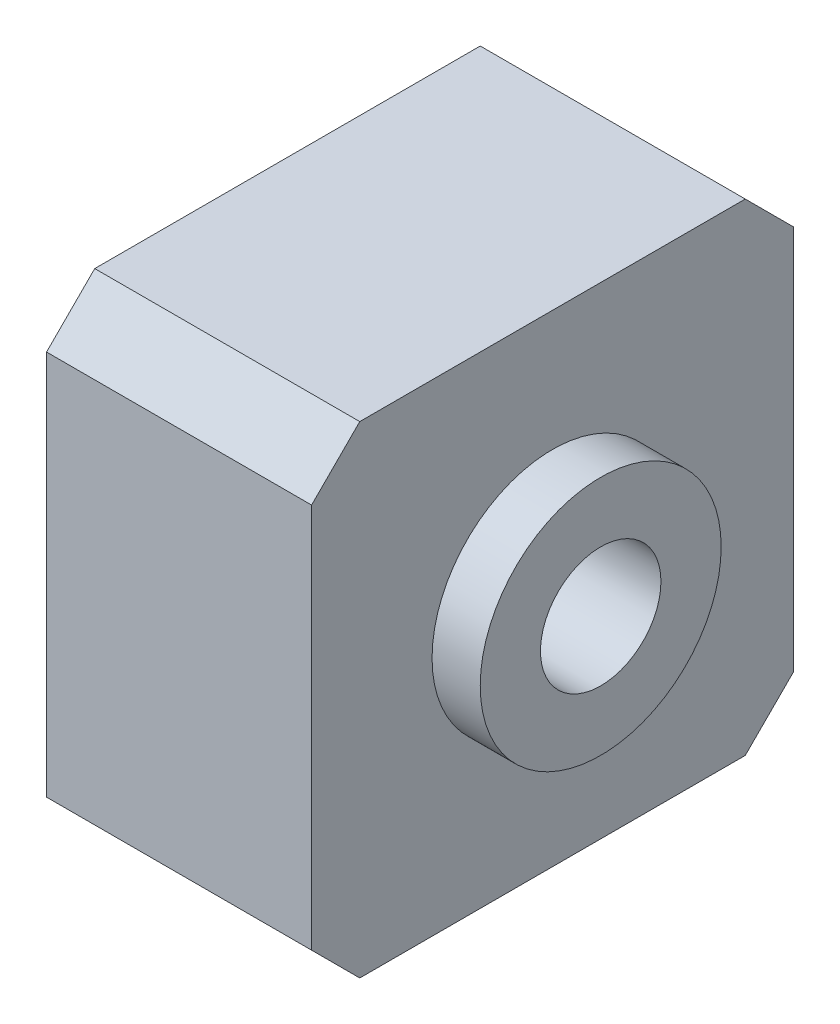
ISO-10303-21;
HEADER;
FILE_DESCRIPTION(('STEP AP214'),'2;1');
FILE_NAME('part.step','',(''),(''),'','','');
FILE_SCHEMA(('AUTOMOTIVE_DESIGN { 1 0 10303 214 1 1 1 1 }'));
ENDSEC;
DATA;
#1=APPLICATION_CONTEXT('core data for automotive mechanical design processes');
#2=APPLICATION_PROTOCOL_DEFINITION('international standard','automotive_design',2000,#1);
#3=PRODUCT_CONTEXT('',#1,'mechanical');
#4=PRODUCT('Part','Part','',(#3));
#5=PRODUCT_RELATED_PRODUCT_CATEGORY('part','',(#4));
#6=PRODUCT_DEFINITION_FORMATION('','',#4);
#7=PRODUCT_DEFINITION_CONTEXT('part definition',#1,'design');
#8=PRODUCT_DEFINITION('design','',#6,#7);
#9=PRODUCT_DEFINITION_SHAPE('','',#8);
#10=(LENGTH_UNIT() NAMED_UNIT(*) SI_UNIT(.MILLI.,.METRE.));
#11=(NAMED_UNIT(*) PLANE_ANGLE_UNIT() SI_UNIT($,.RADIAN.));
#12=(NAMED_UNIT(*) SI_UNIT($,.STERADIAN.) SOLID_ANGLE_UNIT());
#13=UNCERTAINTY_MEASURE_WITH_UNIT(LENGTH_MEASURE(1.E-05),#10,'distance_accuracy_value','');
#14=(GEOMETRIC_REPRESENTATION_CONTEXT(3) GLOBAL_UNCERTAINTY_ASSIGNED_CONTEXT((#13)) GLOBAL_UNIT_ASSIGNED_CONTEXT((#10,
#11,#12)) REPRESENTATION_CONTEXT('',''));
#15=CARTESIAN_POINT('',(0.,0.,0.));
#16=DIRECTION('',(0.,0.,1.));
#17=DIRECTION('',(1.,0.,0.));
#18=AXIS2_PLACEMENT_3D('',#15,#16,#17);
#19=CARTESIAN_POINT('',(-17.,10.,9.99999999999999));
#20=DIRECTION('',(0.,0.,1.));
#21=DIRECTION('',(0.,-1.,0.));
#22=AXIS2_PLACEMENT_3D('',#19,#20,#21);
#23=PLANE('',#22);
#24=DIRECTION('',(0.,-1.,0.));
#25=VECTOR('',#24,1.);
#26=CARTESIAN_POINT('',(-13.,10.,9.99999999999999));
#27=LINE('',#26,#25);
#28=CARTESIAN_POINT('',(-13.,8.,9.99999999999999));
#29=VERTEX_POINT('',#28);
#30=CARTESIAN_POINT('',(-13.,-8.,10.));
#31=VERTEX_POINT('',#30);
#32=EDGE_CURVE('E144',#29,#31,#27,.T.);
#33=ORIENTED_EDGE('',*,*,#32,.T.);
#34=DIRECTION('',(1.,0.,0.));
#35=VECTOR('',#34,1.);
#36=CARTESIAN_POINT('',(-17.,-8.,10.));
#37=LINE('',#36,#35);
#38=CARTESIAN_POINT('',(-2.,-8.,10.));
#39=VERTEX_POINT('',#38);
#40=EDGE_CURVE('E121',#31,#39,#37,.T.);
#41=ORIENTED_EDGE('',*,*,#40,.T.);
#42=DIRECTION('',(0.,1.,0.));
#43=VECTOR('',#42,1.);
#44=CARTESIAN_POINT('',(-2.,10.,9.99999999999999));
#45=LINE('',#44,#43);
#46=CARTESIAN_POINT('',(-2.,8.,9.99999999999999));
#47=VERTEX_POINT('',#46);
#48=EDGE_CURVE('E164',#39,#47,#45,.T.);
#49=ORIENTED_EDGE('',*,*,#48,.T.);
#50=DIRECTION('',(-1.,0.,0.));
#51=VECTOR('',#50,1.);
#52=CARTESIAN_POINT('',(-17.,8.,9.99999999999999));
#53=LINE('',#52,#51);
#54=EDGE_CURVE('E56',#47,#29,#53,.T.);
#55=ORIENTED_EDGE('',*,*,#54,.T.);
#56=EDGE_LOOP('',(#33,#41,#49,#55));
#57=FACE_BOUND('',#56,.T.);
#58=ADVANCED_FACE('F34',(#57),#23,.T.);
#59=CARTESIAN_POINT('',(-17.,10.,-9.99999999999999));
#60=DIRECTION('',(0.,1.,0.));
#61=DIRECTION('',(0.,0.,1.));
#62=AXIS2_PLACEMENT_3D('',#59,#60,#61);
#63=PLANE('',#62);
#64=DIRECTION('',(0.,0.,1.));
#65=VECTOR('',#64,1.);
#66=CARTESIAN_POINT('',(-13.,10.,-9.99999999999999));
#67=LINE('',#66,#65);
#68=CARTESIAN_POINT('',(-13.,10.,-7.99999999999999));
#69=VERTEX_POINT('',#68);
#70=CARTESIAN_POINT('',(-13.,10.,8.));
#71=VERTEX_POINT('',#70);
#72=EDGE_CURVE('E136',#69,#71,#67,.T.);
#73=ORIENTED_EDGE('',*,*,#72,.T.);
#74=DIRECTION('',(1.,0.,0.));
#75=VECTOR('',#74,1.);
#76=CARTESIAN_POINT('',(-17.,10.,8.));
#77=LINE('',#76,#75);
#78=CARTESIAN_POINT('',(-2.,10.,8.));
#79=VERTEX_POINT('',#78);
#80=EDGE_CURVE('E11',#71,#79,#77,.T.);
#81=ORIENTED_EDGE('',*,*,#80,.T.);
#82=DIRECTION('',(0.,0.,-1.));
#83=VECTOR('',#82,1.);
#84=CARTESIAN_POINT('',(-2.,10.,-9.99999999999999));
#85=LINE('',#84,#83);
#86=CARTESIAN_POINT('',(-2.,10.,-7.99999999999999));
#87=VERTEX_POINT('',#86);
#88=EDGE_CURVE('E139',#79,#87,#85,.T.);
#89=ORIENTED_EDGE('',*,*,#88,.T.);
#90=DIRECTION('',(-1.,0.,0.));
#91=VECTOR('',#90,1.);
#92=CARTESIAN_POINT('',(-17.,10.,-7.99999999999999));
#93=LINE('',#92,#91);
#94=EDGE_CURVE('E42',#87,#69,#93,.T.);
#95=ORIENTED_EDGE('',*,*,#94,.T.);
#96=EDGE_LOOP('',(#73,#81,#89,#95));
#97=FACE_BOUND('',#96,.T.);
#98=ADVANCED_FACE('F135',(#97),#63,.T.);
#99=CARTESIAN_POINT('',(-17.,-10.,-10.));
#100=DIRECTION('',(0.,0.,-1.));
#101=DIRECTION('',(0.,1.,0.));
#102=AXIS2_PLACEMENT_3D('',#99,#100,#101);
#103=PLANE('',#102);
#104=CARTESIAN_POINT('',(-7.,0.,-10.));
#105=DIRECTION('',(0.,0.,-1.));
#106=DIRECTION('',(0.,1.,0.));
#107=AXIS2_PLACEMENT_3D('',#104,#105,#106);
#108=CIRCLE('',#107,2.75);
#109=CARTESIAN_POINT('',(-7.,2.75,-10.));
#110=VERTEX_POINT('',#109);
#111=EDGE_CURVE('E191',#110,#110,#108,.T.);
#112=ORIENTED_EDGE('',*,*,#111,.F.);
#113=EDGE_LOOP('',(#112));
#114=FACE_BOUND('',#113,.T.);
#115=DIRECTION('',(0.,-1.,0.));
#116=VECTOR('',#115,1.);
#117=CARTESIAN_POINT('',(-2.,-10.,-10.));
#118=LINE('',#117,#116);
#119=CARTESIAN_POINT('',(-2.,8.,-9.99999999999999));
#120=VERTEX_POINT('',#119);
#121=CARTESIAN_POINT('',(-2.,-8.,-10.));
#122=VERTEX_POINT('',#121);
#123=EDGE_CURVE('E167',#120,#122,#118,.T.);
#124=ORIENTED_EDGE('',*,*,#123,.T.);
#125=DIRECTION('',(-1.,0.,0.));
#126=VECTOR('',#125,1.);
#127=CARTESIAN_POINT('',(-17.,-8.,-10.));
#128=LINE('',#127,#126);
#129=CARTESIAN_POINT('',(-13.,-8.,-10.));
#130=VERTEX_POINT('',#129);
#131=EDGE_CURVE('E150',#122,#130,#128,.T.);
#132=ORIENTED_EDGE('',*,*,#131,.T.);
#133=DIRECTION('',(0.,1.,0.));
#134=VECTOR('',#133,1.);
#135=CARTESIAN_POINT('',(-13.,-10.,-10.));
#136=LINE('',#135,#134);
#137=CARTESIAN_POINT('',(-13.,8.,-9.99999999999999));
#138=VERTEX_POINT('',#137);
#139=EDGE_CURVE('E145',#130,#138,#136,.T.);
#140=ORIENTED_EDGE('',*,*,#139,.T.);
#141=DIRECTION('',(1.,0.,0.));
#142=VECTOR('',#141,1.);
#143=CARTESIAN_POINT('',(-17.,8.,-9.99999999999999));
#144=LINE('',#143,#142);
#145=EDGE_CURVE('E149',#138,#120,#144,.T.);
#146=ORIENTED_EDGE('',*,*,#145,.T.);
#147=EDGE_LOOP('',(#124,#132,#140,#146));
#148=FACE_BOUND('',#147,.T.);
#149=ADVANCED_FACE('F205',(#114,#148),#103,.T.);
#150=CARTESIAN_POINT('',(-17.,-10.,10.));
#151=DIRECTION('',(0.,-1.,0.));
#152=DIRECTION('',(0.,0.,-1.));
#153=AXIS2_PLACEMENT_3D('',#150,#151,#152);
#154=PLANE('',#153);
#155=DIRECTION('',(0.,0.,-1.));
#156=VECTOR('',#155,1.);
#157=CARTESIAN_POINT('',(-13.,-10.,10.));
#158=LINE('',#157,#156);
#159=CARTESIAN_POINT('',(-13.,-10.,7.99999999999999));
#160=VERTEX_POINT('',#159);
#161=CARTESIAN_POINT('',(-13.,-10.,-8.00000000000001));
#162=VERTEX_POINT('',#161);
#163=EDGE_CURVE('E105',#160,#162,#158,.T.);
#164=ORIENTED_EDGE('',*,*,#163,.T.);
#165=DIRECTION('',(1.,0.,0.));
#166=VECTOR('',#165,1.);
#167=CARTESIAN_POINT('',(-17.,-10.,-8.00000000000001));
#168=LINE('',#167,#166);
#169=CARTESIAN_POINT('',(-2.,-10.,-8.00000000000001));
#170=VERTEX_POINT('',#169);
#171=EDGE_CURVE('E110',#162,#170,#168,.T.);
#172=ORIENTED_EDGE('',*,*,#171,.T.);
#173=DIRECTION('',(0.,0.,1.));
#174=VECTOR('',#173,1.);
#175=CARTESIAN_POINT('',(-2.,-10.,10.));
#176=LINE('',#175,#174);
#177=CARTESIAN_POINT('',(-2.,-10.,7.99999999999999));
#178=VERTEX_POINT('',#177);
#179=EDGE_CURVE('E108',#170,#178,#176,.T.);
#180=ORIENTED_EDGE('',*,*,#179,.T.);
#181=DIRECTION('',(-1.,0.,0.));
#182=VECTOR('',#181,1.);
#183=CARTESIAN_POINT('',(-17.,-10.,7.99999999999999));
#184=LINE('',#183,#182);
#185=EDGE_CURVE('E102',#178,#160,#184,.T.);
#186=ORIENTED_EDGE('',*,*,#185,.T.);
#187=EDGE_LOOP('',(#164,#172,#180,#186));
#188=FACE_BOUND('',#187,.T.);
#189=ADVANCED_FACE('F103',(#188),#154,.T.);
#190=CARTESIAN_POINT('',(-2.,0.,0.));
#191=DIRECTION('',(1.,0.,0.));
#192=DIRECTION('',(0.,0.,-1.));
#193=AXIS2_PLACEMENT_3D('',#190,#191,#192);
#194=PLANE('',#193);
#195=ORIENTED_EDGE('',*,*,#179,.F.);
#196=DIRECTION('',(0.,-0.707106781186549,0.707106781186546));
#197=VECTOR('',#196,1.);
#198=CARTESIAN_POINT('',(-2.,-8.99999999999998,-9.00000000000002));
#199=LINE('',#198,#197);
#200=EDGE_CURVE('E154',#170,#122,#199,.F.);
#201=ORIENTED_EDGE('',*,*,#200,.T.);
#202=ORIENTED_EDGE('',*,*,#123,.F.);
#203=DIRECTION('',(0.,-0.707106781186546,-0.707106781186549));
#204=VECTOR('',#203,1.);
#205=CARTESIAN_POINT('',(-2.,9.00000000000002,-8.99999999999997));
#206=LINE('',#205,#204);
#207=EDGE_CURVE('E160',#120,#87,#206,.F.);
#208=ORIENTED_EDGE('',*,*,#207,.T.);
#209=ORIENTED_EDGE('',*,*,#88,.F.);
#210=DIRECTION('',(0.,0.707106781186549,-0.707106781186546));
#211=VECTOR('',#210,1.);
#212=CARTESIAN_POINT('',(-2.,8.99999999999997,9.00000000000002));
#213=LINE('',#212,#211);
#214=EDGE_CURVE('E158',#79,#47,#213,.F.);
#215=ORIENTED_EDGE('',*,*,#214,.T.);
#216=ORIENTED_EDGE('',*,*,#48,.F.);
#217=DIRECTION('',(0.,0.707106781186546,0.707106781186549));
#218=VECTOR('',#217,1.);
#219=CARTESIAN_POINT('',(-2.,-9.00000000000002,8.99999999999997));
#220=LINE('',#219,#218);
#221=EDGE_CURVE('E156',#39,#178,#220,.F.);
#222=ORIENTED_EDGE('',*,*,#221,.T.);
#223=EDGE_LOOP('',(#195,#201,#202,#208,#209,#215,#216,#222));
#224=FACE_BOUND('',#223,.T.);
#225=CARTESIAN_POINT('',(-2.,0.,0.));
#226=DIRECTION('',(1.,0.,0.));
#227=DIRECTION('',(0.,0.,-1.));
#228=AXIS2_PLACEMENT_3D('',#225,#226,#227);
#229=CIRCLE('',#228,5.);
#230=CARTESIAN_POINT('',(-2.,0.,-5.));
#231=VERTEX_POINT('',#230);
#232=EDGE_CURVE('E170',#231,#231,#229,.T.);
#233=ORIENTED_EDGE('',*,*,#232,.F.);
#234=EDGE_LOOP('',(#233));
#235=FACE_BOUND('',#234,.T.);
#236=ADVANCED_FACE('F214',(#224,#235),#194,.T.);
#237=CARTESIAN_POINT('',(-2.,0.,0.));
#238=DIRECTION('',(1.,0.,0.));
#239=DIRECTION('',(0.,0.,-1.));
#240=AXIS2_PLACEMENT_3D('',#237,#238,#239);
#241=CYLINDRICAL_SURFACE('',#240,5.);
#242=ORIENTED_EDGE('',*,*,#232,.T.);
#243=EDGE_LOOP('',(#242));
#244=FACE_BOUND('',#243,.T.);
#245=CARTESIAN_POINT('',(0.,0.,0.));
#246=DIRECTION('',(1.,0.,0.));
#247=DIRECTION('',(0.,0.,-1.));
#248=AXIS2_PLACEMENT_3D('',#245,#246,#247);
#249=CIRCLE('',#248,5.);
#250=CARTESIAN_POINT('',(0.,0.,-5.));
#251=VERTEX_POINT('',#250);
#252=EDGE_CURVE('E171',#251,#251,#249,.T.);
#253=ORIENTED_EDGE('',*,*,#252,.F.);
#254=EDGE_LOOP('',(#253));
#255=FACE_BOUND('',#254,.T.);
#256=ADVANCED_FACE('F257',(#244,#255),#241,.T.);
#257=CARTESIAN_POINT('',(0.,0.,0.));
#258=DIRECTION('',(1.,0.,0.));
#259=DIRECTION('',(0.,0.,-1.));
#260=AXIS2_PLACEMENT_3D('',#257,#258,#259);
#261=PLANE('',#260);
#262=CARTESIAN_POINT('',(0.,0.,0.));
#263=DIRECTION('',(1.,0.,0.));
#264=DIRECTION('',(0.,0.,-1.));
#265=AXIS2_PLACEMENT_3D('',#262,#263,#264);
#266=CIRCLE('',#265,2.5);
#267=CARTESIAN_POINT('',(0.,0.,-2.5));
#268=VERTEX_POINT('',#267);
#269=EDGE_CURVE('E185',#268,#268,#266,.T.);
#270=ORIENTED_EDGE('',*,*,#269,.F.);
#271=EDGE_LOOP('',(#270));
#272=FACE_BOUND('',#271,.T.);
#273=ORIENTED_EDGE('',*,*,#252,.T.);
#274=EDGE_LOOP('',(#273));
#275=FACE_BOUND('',#274,.T.);
#276=ADVANCED_FACE('F256',(#272,#275),#261,.T.);
#277=CARTESIAN_POINT('',(-13.,0.,0.));
#278=DIRECTION('',(-1.,0.,0.));
#279=DIRECTION('',(0.,0.,1.));
#280=AXIS2_PLACEMENT_3D('',#277,#278,#279);
#281=PLANE('',#280);
#282=ORIENTED_EDGE('',*,*,#139,.F.);
#283=DIRECTION('',(0.,0.707106781186549,-0.707106781186546));
#284=VECTOR('',#283,1.);
#285=CARTESIAN_POINT('',(-13.,-8.99999999999998,-9.00000000000002));
#286=LINE('',#285,#284);
#287=EDGE_CURVE('E116',#130,#162,#286,.F.);
#288=ORIENTED_EDGE('',*,*,#287,.T.);
#289=ORIENTED_EDGE('',*,*,#163,.F.);
#290=DIRECTION('',(0.,-0.707106781186546,-0.707106781186549));
#291=VECTOR('',#290,1.);
#292=CARTESIAN_POINT('',(-13.,-9.00000000000002,8.99999999999997));
#293=LINE('',#292,#291);
#294=EDGE_CURVE('E49',#160,#31,#293,.F.);
#295=ORIENTED_EDGE('',*,*,#294,.T.);
#296=ORIENTED_EDGE('',*,*,#32,.F.);
#297=DIRECTION('',(0.,-0.707106781186549,0.707106781186546));
#298=VECTOR('',#297,1.);
#299=CARTESIAN_POINT('',(-13.,8.99999999999997,9.00000000000002));
#300=LINE('',#299,#298);
#301=EDGE_CURVE('E122',#29,#71,#300,.F.);
#302=ORIENTED_EDGE('',*,*,#301,.T.);
#303=ORIENTED_EDGE('',*,*,#72,.F.);
#304=DIRECTION('',(0.,0.707106781186546,0.707106781186549));
#305=VECTOR('',#304,1.);
#306=CARTESIAN_POINT('',(-13.,9.00000000000002,-8.99999999999997));
#307=LINE('',#306,#305);
#308=EDGE_CURVE('E125',#69,#138,#307,.F.);
#309=ORIENTED_EDGE('',*,*,#308,.T.);
#310=EDGE_LOOP('',(#282,#288,#289,#295,#296,#302,#303,#309));
#311=FACE_BOUND('',#310,.T.);
#312=CARTESIAN_POINT('',(-13.,0.,0.));
#313=DIRECTION('',(-1.,0.,0.));
#314=DIRECTION('',(0.,0.,1.));
#315=AXIS2_PLACEMENT_3D('',#312,#313,#314);
#316=CIRCLE('',#315,5.);
#317=CARTESIAN_POINT('',(-13.,0.,5.));
#318=VERTEX_POINT('',#317);
#319=EDGE_CURVE('E178',#318,#318,#316,.T.);
#320=ORIENTED_EDGE('',*,*,#319,.F.);
#321=EDGE_LOOP('',(#320));
#322=FACE_BOUND('',#321,.T.);
#323=ADVANCED_FACE('F113',(#311,#322),#281,.T.);
#324=CARTESIAN_POINT('',(-13.,0.,0.));
#325=DIRECTION('',(-1.,0.,0.));
#326=DIRECTION('',(0.,0.,1.));
#327=AXIS2_PLACEMENT_3D('',#324,#325,#326);
#328=CYLINDRICAL_SURFACE('',#327,5.);
#329=ORIENTED_EDGE('',*,*,#319,.T.);
#330=EDGE_LOOP('',(#329));
#331=FACE_BOUND('',#330,.T.);
#332=CARTESIAN_POINT('',(-17.,0.,0.));
#333=DIRECTION('',(-1.,0.,0.));
#334=DIRECTION('',(0.,0.,1.));
#335=AXIS2_PLACEMENT_3D('',#332,#333,#334);
#336=CIRCLE('',#335,5.);
#337=CARTESIAN_POINT('',(-17.,0.,5.));
#338=VERTEX_POINT('',#337);
#339=EDGE_CURVE('E179',#338,#338,#336,.T.);
#340=ORIENTED_EDGE('',*,*,#339,.F.);
#341=EDGE_LOOP('',(#340));
#342=FACE_BOUND('',#341,.T.);
#343=ADVANCED_FACE('F244',(#331,#342),#328,.T.);
#344=CARTESIAN_POINT('',(-17.,0.,0.));
#345=DIRECTION('',(1.,0.,0.));
#346=DIRECTION('',(0.,0.,-1.));
#347=AXIS2_PLACEMENT_3D('',#344,#345,#346);
#348=PLANE('',#347);
#349=CARTESIAN_POINT('',(-17.,0.,0.));
#350=DIRECTION('',(1.,0.,0.));
#351=DIRECTION('',(0.,0.,-1.));
#352=AXIS2_PLACEMENT_3D('',#349,#350,#351);
#353=CIRCLE('',#352,2.5);
#354=CARTESIAN_POINT('',(-17.,0.,-2.5));
#355=VERTEX_POINT('',#354);
#356=EDGE_CURVE('E182',#355,#355,#353,.T.);
#357=ORIENTED_EDGE('',*,*,#356,.T.);
#358=EDGE_LOOP('',(#357));
#359=FACE_BOUND('',#358,.T.);
#360=ORIENTED_EDGE('',*,*,#339,.T.);
#361=EDGE_LOOP('',(#360));
#362=FACE_BOUND('',#361,.T.);
#363=ADVANCED_FACE('F238',(#359,#362),#348,.F.);
#364=CARTESIAN_POINT('',(-17.,0.,0.));
#365=DIRECTION('',(1.,0.,0.));
#366=DIRECTION('',(0.,0.,-1.));
#367=AXIS2_PLACEMENT_3D('',#364,#365,#366);
#368=CYLINDRICAL_SURFACE('',#367,2.5);
#369=ORIENTED_EDGE('',*,*,#356,.F.);
#370=EDGE_LOOP('',(#369));
#371=FACE_BOUND('',#370,.T.);
#372=ORIENTED_EDGE('',*,*,#269,.T.);
#373=EDGE_LOOP('',(#372));
#374=FACE_BOUND('',#373,.T.);
#375=ADVANCED_FACE('F234',(#371,#374),#368,.F.);
#376=CARTESIAN_POINT('',(-17.,-10.,-8.00000000000001));
#377=DIRECTION('',(0.,0.707106781186546,0.707106781186549));
#378=DIRECTION('',(1.,0.,0.));
#379=AXIS2_PLACEMENT_3D('',#376,#377,#378);
#380=PLANE('',#379);
#381=ORIENTED_EDGE('',*,*,#287,.F.);
#382=ORIENTED_EDGE('',*,*,#131,.F.);
#383=ORIENTED_EDGE('',*,*,#200,.F.);
#384=ORIENTED_EDGE('',*,*,#171,.F.);
#385=EDGE_LOOP('',(#381,#382,#383,#384));
#386=FACE_BOUND('',#385,.T.);
#387=ADVANCED_FACE('F213',(#386),#380,.F.);
#388=CARTESIAN_POINT('',(-17.,-8.,10.));
#389=DIRECTION('',(0.,0.707106781186549,-0.707106781186546));
#390=DIRECTION('',(1.,0.,0.));
#391=AXIS2_PLACEMENT_3D('',#388,#389,#390);
#392=PLANE('',#391);
#393=ORIENTED_EDGE('',*,*,#294,.F.);
#394=ORIENTED_EDGE('',*,*,#185,.F.);
#395=ORIENTED_EDGE('',*,*,#221,.F.);
#396=ORIENTED_EDGE('',*,*,#40,.F.);
#397=EDGE_LOOP('',(#393,#394,#395,#396));
#398=FACE_BOUND('',#397,.T.);
#399=ADVANCED_FACE('F119',(#398),#392,.F.);
#400=CARTESIAN_POINT('',(-17.,10.,8.));
#401=DIRECTION('',(0.,-0.707106781186546,-0.707106781186549));
#402=DIRECTION('',(1.,0.,0.));
#403=AXIS2_PLACEMENT_3D('',#400,#401,#402);
#404=PLANE('',#403);
#405=ORIENTED_EDGE('',*,*,#301,.F.);
#406=ORIENTED_EDGE('',*,*,#54,.F.);
#407=ORIENTED_EDGE('',*,*,#214,.F.);
#408=ORIENTED_EDGE('',*,*,#80,.F.);
#409=EDGE_LOOP('',(#405,#406,#407,#408));
#410=FACE_BOUND('',#409,.T.);
#411=ADVANCED_FACE('F218',(#410),#404,.F.);
#412=CARTESIAN_POINT('',(-17.,8.,-9.99999999999999));
#413=DIRECTION('',(0.,-0.707106781186549,0.707106781186546));
#414=DIRECTION('',(1.,0.,0.));
#415=AXIS2_PLACEMENT_3D('',#412,#413,#414);
#416=PLANE('',#415);
#417=ORIENTED_EDGE('',*,*,#308,.F.);
#418=ORIENTED_EDGE('',*,*,#94,.F.);
#419=ORIENTED_EDGE('',*,*,#207,.F.);
#420=ORIENTED_EDGE('',*,*,#145,.F.);
#421=EDGE_LOOP('',(#417,#418,#419,#420));
#422=FACE_BOUND('',#421,.T.);
#423=ADVANCED_FACE('F36',(#422),#416,.F.);
#424=CARTESIAN_POINT('',(-7.,0.,-8.));
#425=DIRECTION('',(0.,0.,-1.));
#426=DIRECTION('',(0.,1.,0.));
#427=AXIS2_PLACEMENT_3D('',#424,#425,#426);
#428=CYLINDRICAL_SURFACE('',#427,2.75);
#429=CARTESIAN_POINT('',(-7.,0.,-8.));
#430=DIRECTION('',(0.,0.,-1.));
#431=DIRECTION('',(0.,1.,0.));
#432=AXIS2_PLACEMENT_3D('',#429,#430,#431);
#433=CIRCLE('',#432,2.75);
#434=CARTESIAN_POINT('',(-7.,2.75,-8.));
#435=VERTEX_POINT('',#434);
#436=EDGE_CURVE('E188',#435,#435,#433,.T.);
#437=ORIENTED_EDGE('',*,*,#436,.F.);
#438=EDGE_LOOP('',(#437));
#439=FACE_BOUND('',#438,.T.);
#440=ORIENTED_EDGE('',*,*,#111,.T.);
#441=EDGE_LOOP('',(#440));
#442=FACE_BOUND('',#441,.T.);
#443=ADVANCED_FACE('F199',(#439,#442),#428,.F.);
#444=CARTESIAN_POINT('',(-7.,0.,-8.));
#445=DIRECTION('',(0.,0.,-1.));
#446=DIRECTION('',(0.,1.,0.));
#447=AXIS2_PLACEMENT_3D('',#444,#445,#446);
#448=PLANE('',#447);
#449=ORIENTED_EDGE('',*,*,#436,.T.);
#450=EDGE_LOOP('',(#449));
#451=FACE_BOUND('',#450,.T.);
#452=ADVANCED_FACE('F197',(#451),#448,.T.);
#453=CLOSED_SHELL('',(#58,#98,#149,#189,#236,#256,#276,#323,#343,#363,#375,#387,#399,#411,#423,
#443,#452));
#454=MANIFOLD_SOLID_BREP('B2',#453);
#455=ADVANCED_BREP_SHAPE_REPRESENTATION('',(#18,#454),#14);
#456=SHAPE_DEFINITION_REPRESENTATION(#9,#455);
ENDSEC;
END-ISO-10303-21;
